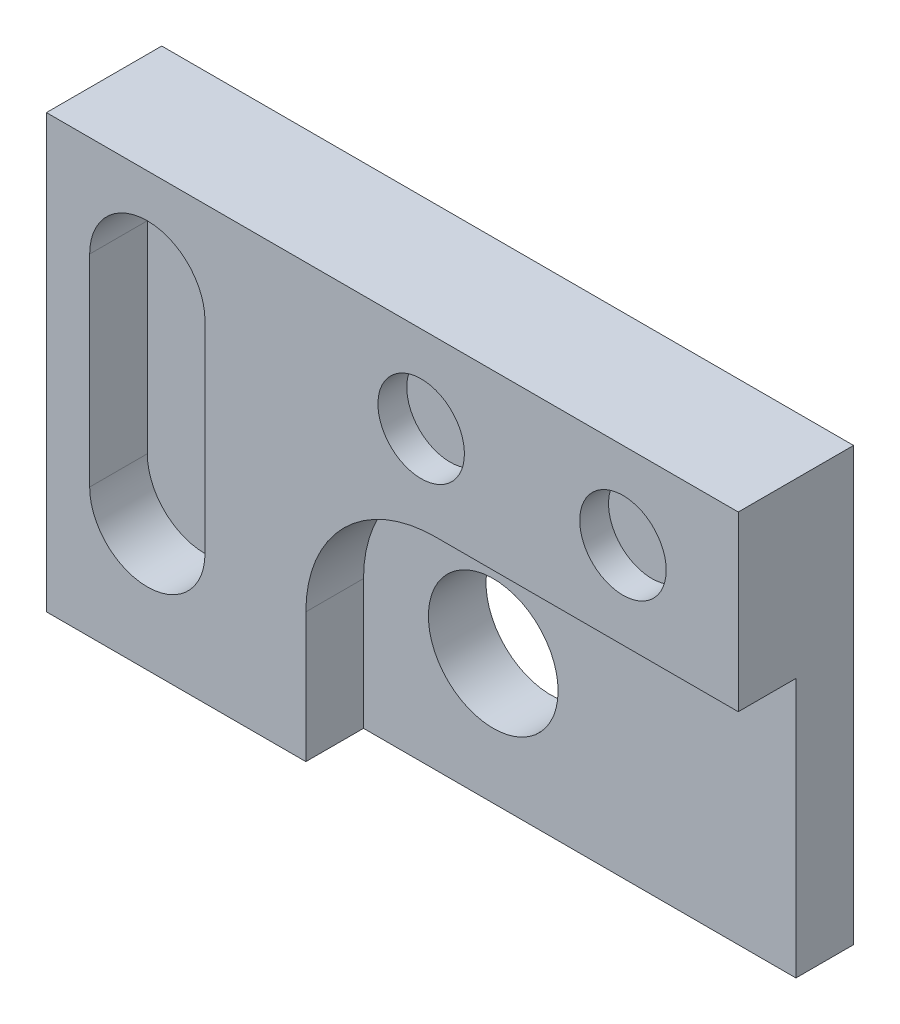
ISO-10303-21;
HEADER;
FILE_DESCRIPTION(('STEP AP214'),'2;1');
FILE_NAME('part.step','',(''),(''),'','','');
FILE_SCHEMA(('AUTOMOTIVE_DESIGN { 1 0 10303 214 1 1 1 1 }'));
ENDSEC;
DATA;
#1=APPLICATION_CONTEXT('core data for automotive mechanical design processes');
#2=APPLICATION_PROTOCOL_DEFINITION('international standard','automotive_design',2000,#1);
#3=PRODUCT_CONTEXT('',#1,'mechanical');
#4=PRODUCT('Part','Part','',(#3));
#5=PRODUCT_RELATED_PRODUCT_CATEGORY('part','',(#4));
#6=PRODUCT_DEFINITION_FORMATION('','',#4);
#7=PRODUCT_DEFINITION_CONTEXT('part definition',#1,'design');
#8=PRODUCT_DEFINITION('design','',#6,#7);
#9=PRODUCT_DEFINITION_SHAPE('','',#8);
#10=(LENGTH_UNIT() NAMED_UNIT(*) SI_UNIT(.MILLI.,.METRE.));
#11=(NAMED_UNIT(*) PLANE_ANGLE_UNIT() SI_UNIT($,.RADIAN.));
#12=(NAMED_UNIT(*) SI_UNIT($,.STERADIAN.) SOLID_ANGLE_UNIT());
#13=UNCERTAINTY_MEASURE_WITH_UNIT(LENGTH_MEASURE(1.E-05),#10,'distance_accuracy_value','');
#14=(GEOMETRIC_REPRESENTATION_CONTEXT(3) GLOBAL_UNCERTAINTY_ASSIGNED_CONTEXT((#13)) GLOBAL_UNIT_ASSIGNED_CONTEXT((#10,
#11,#12)) REPRESENTATION_CONTEXT('',''));
#15=CARTESIAN_POINT('',(0.,0.,0.));
#16=DIRECTION('',(0.,0.,1.));
#17=DIRECTION('',(1.,0.,0.));
#18=AXIS2_PLACEMENT_3D('',#15,#16,#17);
#19=CARTESIAN_POINT('',(15.,-30.,0.));
#20=DIRECTION('',(0.,0.,1.));
#21=DIRECTION('',(1.,0.,0.));
#22=AXIS2_PLACEMENT_3D('',#19,#20,#21);
#23=CYLINDRICAL_SURFACE('',#22,22.5);
#24=CARTESIAN_POINT('',(15.,-30.,0.));
#25=DIRECTION('',(0.,0.,1.));
#26=DIRECTION('',(1.,0.,0.));
#27=AXIS2_PLACEMENT_3D('',#24,#25,#26);
#28=CIRCLE('',#27,22.5);
#29=CARTESIAN_POINT('',(37.5,-30.,0.));
#30=VERTEX_POINT('',#29);
#31=EDGE_CURVE('E203',#30,#30,#28,.T.);
#32=ORIENTED_EDGE('',*,*,#31,.F.);
#33=EDGE_LOOP('',(#32));
#34=FACE_BOUND('',#33,.T.);
#35=CARTESIAN_POINT('',(15.,-30.,20.));
#36=DIRECTION('',(0.,0.,1.));
#37=DIRECTION('',(1.,0.,0.));
#38=AXIS2_PLACEMENT_3D('',#35,#36,#37);
#39=CIRCLE('',#38,22.5);
#40=CARTESIAN_POINT('',(37.5,-30.,20.));
#41=VERTEX_POINT('',#40);
#42=EDGE_CURVE('E165',#41,#41,#39,.T.);
#43=ORIENTED_EDGE('',*,*,#42,.T.);
#44=EDGE_LOOP('',(#43));
#45=FACE_BOUND('',#44,.T.);
#46=ADVANCED_FACE('F52',(#34,#45),#23,.F.);
#47=CARTESIAN_POINT('',(120.,-75.,40.));
#48=DIRECTION('',(-1.,0.,0.));
#49=DIRECTION('',(0.,-1.,0.));
#50=AXIS2_PLACEMENT_3D('',#47,#48,#49);
#51=PLANE('',#50);
#52=DIRECTION('',(0.,1.,0.));
#53=VECTOR('',#52,1.);
#54=CARTESIAN_POINT('',(120.,-75.,40.));
#55=LINE('',#54,#53);
#56=CARTESIAN_POINT('',(120.,15.,40.));
#57=VERTEX_POINT('',#56);
#58=CARTESIAN_POINT('',(120.,75.,40.));
#59=VERTEX_POINT('',#58);
#60=EDGE_CURVE('E298',#57,#59,#55,.T.);
#61=ORIENTED_EDGE('',*,*,#60,.F.);
#62=DIRECTION('',(0.,0.,1.));
#63=VECTOR('',#62,1.);
#64=CARTESIAN_POINT('',(120.,15.,20.));
#65=LINE('',#64,#63);
#66=CARTESIAN_POINT('',(120.,15.,20.));
#67=VERTEX_POINT('',#66);
#68=EDGE_CURVE('E199',#67,#57,#65,.T.);
#69=ORIENTED_EDGE('',*,*,#68,.F.);
#70=DIRECTION('',(0.,1.,0.));
#71=VECTOR('',#70,1.);
#72=CARTESIAN_POINT('',(120.,0.,20.));
#73=LINE('',#72,#71);
#74=CARTESIAN_POINT('',(120.,-75.,20.));
#75=VERTEX_POINT('',#74);
#76=EDGE_CURVE('E150',#75,#67,#73,.T.);
#77=ORIENTED_EDGE('',*,*,#76,.F.);
#78=DIRECTION('',(0.,0.,-1.));
#79=VECTOR('',#78,1.);
#80=CARTESIAN_POINT('',(120.,-75.,40.));
#81=LINE('',#80,#79);
#82=CARTESIAN_POINT('',(120.,-75.,0.));
#83=VERTEX_POINT('',#82);
#84=EDGE_CURVE('E312',#75,#83,#81,.T.);
#85=ORIENTED_EDGE('',*,*,#84,.T.);
#86=DIRECTION('',(0.,1.,0.));
#87=VECTOR('',#86,1.);
#88=CARTESIAN_POINT('',(120.,-75.,0.));
#89=LINE('',#88,#87);
#90=CARTESIAN_POINT('',(120.,75.,0.));
#91=VERTEX_POINT('',#90);
#92=EDGE_CURVE('E286',#83,#91,#89,.T.);
#93=ORIENTED_EDGE('',*,*,#92,.T.);
#94=DIRECTION('',(0.,0.,-1.));
#95=VECTOR('',#94,1.);
#96=CARTESIAN_POINT('',(120.,75.,40.));
#97=LINE('',#96,#95);
#98=EDGE_CURVE('E12',#59,#91,#97,.T.);
#99=ORIENTED_EDGE('',*,*,#98,.F.);
#100=EDGE_LOOP('',(#61,#69,#77,#85,#93,#99));
#101=FACE_BOUND('',#100,.T.);
#102=ADVANCED_FACE('F54',(#101),#51,.F.);
#103=CARTESIAN_POINT('',(-120.,75.,40.));
#104=DIRECTION('',(0.,-1.,0.));
#105=DIRECTION('',(1.,0.,0.));
#106=AXIS2_PLACEMENT_3D('',#103,#104,#105);
#107=PLANE('',#106);
#108=DIRECTION('',(-1.,0.,0.));
#109=VECTOR('',#108,1.);
#110=CARTESIAN_POINT('',(-120.,75.,0.));
#111=LINE('',#110,#109);
#112=CARTESIAN_POINT('',(-120.,75.,0.));
#113=VERTEX_POINT('',#112);
#114=EDGE_CURVE('E316',#91,#113,#111,.T.);
#115=ORIENTED_EDGE('',*,*,#114,.T.);
#116=DIRECTION('',(0.,0.,-1.));
#117=VECTOR('',#116,1.);
#118=CARTESIAN_POINT('',(-120.,75.,40.));
#119=LINE('',#118,#117);
#120=CARTESIAN_POINT('',(-120.,75.,40.));
#121=VERTEX_POINT('',#120);
#122=EDGE_CURVE('E61',#121,#113,#119,.T.);
#123=ORIENTED_EDGE('',*,*,#122,.F.);
#124=DIRECTION('',(-1.,0.,0.));
#125=VECTOR('',#124,1.);
#126=CARTESIAN_POINT('',(-120.,75.,40.));
#127=LINE('',#126,#125);
#128=EDGE_CURVE('E301',#59,#121,#127,.T.);
#129=ORIENTED_EDGE('',*,*,#128,.F.);
#130=ORIENTED_EDGE('',*,*,#98,.T.);
#131=EDGE_LOOP('',(#115,#123,#129,#130));
#132=FACE_BOUND('',#131,.T.);
#133=ADVANCED_FACE('F356',(#132),#107,.F.);
#134=CARTESIAN_POINT('',(-120.,-75.,40.));
#135=DIRECTION('',(1.,0.,0.));
#136=DIRECTION('',(0.,0.,-1.));
#137=AXIS2_PLACEMENT_3D('',#134,#135,#136);
#138=PLANE('',#137);
#139=DIRECTION('',(0.,-1.,0.));
#140=VECTOR('',#139,1.);
#141=CARTESIAN_POINT('',(-120.,-75.,0.));
#142=LINE('',#141,#140);
#143=CARTESIAN_POINT('',(-120.,-75.,0.));
#144=VERTEX_POINT('',#143);
#145=EDGE_CURVE('E319',#113,#144,#142,.T.);
#146=ORIENTED_EDGE('',*,*,#145,.T.);
#147=DIRECTION('',(0.,0.,-1.));
#148=VECTOR('',#147,1.);
#149=CARTESIAN_POINT('',(-120.,-75.,40.));
#150=LINE('',#149,#148);
#151=CARTESIAN_POINT('',(-120.,-75.,40.));
#152=VERTEX_POINT('',#151);
#153=EDGE_CURVE('E327',#152,#144,#150,.T.);
#154=ORIENTED_EDGE('',*,*,#153,.F.);
#155=DIRECTION('',(0.,-1.,0.));
#156=VECTOR('',#155,1.);
#157=CARTESIAN_POINT('',(-120.,-75.,40.));
#158=LINE('',#157,#156);
#159=EDGE_CURVE('E305',#121,#152,#158,.T.);
#160=ORIENTED_EDGE('',*,*,#159,.F.);
#161=ORIENTED_EDGE('',*,*,#122,.T.);
#162=EDGE_LOOP('',(#146,#154,#160,#161));
#163=FACE_BOUND('',#162,.T.);
#164=ADVANCED_FACE('F337',(#163),#138,.F.);
#165=CARTESIAN_POINT('',(-120.,-75.,40.));
#166=DIRECTION('',(0.,1.,0.));
#167=DIRECTION('',(0.,0.,1.));
#168=AXIS2_PLACEMENT_3D('',#165,#166,#167);
#169=PLANE('',#168);
#170=DIRECTION('',(1.,0.,0.));
#171=VECTOR('',#170,1.);
#172=CARTESIAN_POINT('',(0.,-75.,20.));
#173=LINE('',#172,#171);
#174=CARTESIAN_POINT('',(-30.,-75.,20.));
#175=VERTEX_POINT('',#174);
#176=EDGE_CURVE('E188',#175,#75,#173,.T.);
#177=ORIENTED_EDGE('',*,*,#176,.F.);
#178=DIRECTION('',(0.,0.,1.));
#179=VECTOR('',#178,1.);
#180=CARTESIAN_POINT('',(-30.,-75.,20.));
#181=LINE('',#180,#179);
#182=CARTESIAN_POINT('',(-30.,-75.,40.));
#183=VERTEX_POINT('',#182);
#184=EDGE_CURVE('E204',#175,#183,#181,.T.);
#185=ORIENTED_EDGE('',*,*,#184,.T.);
#186=DIRECTION('',(1.,0.,0.));
#187=VECTOR('',#186,1.);
#188=CARTESIAN_POINT('',(-120.,-75.,40.));
#189=LINE('',#188,#187);
#190=EDGE_CURVE('E308',#152,#183,#189,.T.);
#191=ORIENTED_EDGE('',*,*,#190,.F.);
#192=ORIENTED_EDGE('',*,*,#153,.T.);
#193=DIRECTION('',(1.,0.,0.));
#194=VECTOR('',#193,1.);
#195=CARTESIAN_POINT('',(-120.,-75.,0.));
#196=LINE('',#195,#194);
#197=EDGE_CURVE('E302',#144,#83,#196,.T.);
#198=ORIENTED_EDGE('',*,*,#197,.T.);
#199=ORIENTED_EDGE('',*,*,#84,.F.);
#200=EDGE_LOOP('',(#177,#185,#191,#192,#198,#199));
#201=FACE_BOUND('',#200,.T.);
#202=ADVANCED_FACE('F348',(#201),#169,.F.);
#203=CARTESIAN_POINT('',(0.,0.,40.));
#204=DIRECTION('',(0.,0.,-1.));
#205=DIRECTION('',(-1.,0.,0.));
#206=AXIS2_PLACEMENT_3D('',#203,#204,#205);
#207=PLANE('',#206);
#208=CARTESIAN_POINT('',(10.,45.,40.));
#209=DIRECTION('',(0.,0.,1.));
#210=DIRECTION('',(1.,0.,0.));
#211=AXIS2_PLACEMENT_3D('',#208,#209,#210);
#212=CIRCLE('',#211,15.);
#213=CARTESIAN_POINT('',(25.,45.,40.));
#214=VERTEX_POINT('',#213);
#215=EDGE_CURVE('E225',#214,#214,#212,.T.);
#216=ORIENTED_EDGE('',*,*,#215,.F.);
#217=EDGE_LOOP('',(#216));
#218=FACE_BOUND('',#217,.T.);
#219=CARTESIAN_POINT('',(80.,45.,40.));
#220=DIRECTION('',(0.,0.,1.));
#221=DIRECTION('',(1.,0.,0.));
#222=AXIS2_PLACEMENT_3D('',#219,#220,#221);
#223=CIRCLE('',#222,15.);
#224=CARTESIAN_POINT('',(95.,45.,40.));
#225=VERTEX_POINT('',#224);
#226=EDGE_CURVE('E219',#225,#225,#223,.T.);
#227=ORIENTED_EDGE('',*,*,#226,.F.);
#228=EDGE_LOOP('',(#227));
#229=FACE_BOUND('',#228,.T.);
#230=CARTESIAN_POINT('',(-85.,40.,40.));
#231=DIRECTION('',(0.,0.,1.));
#232=DIRECTION('',(1.,0.,0.));
#233=AXIS2_PLACEMENT_3D('',#230,#231,#232);
#234=CIRCLE('',#233,20.);
#235=CARTESIAN_POINT('',(-65.,40.,40.));
#236=VERTEX_POINT('',#235);
#237=CARTESIAN_POINT('',(-105.,40.,40.));
#238=VERTEX_POINT('',#237);
#239=EDGE_CURVE('E271',#236,#238,#234,.T.);
#240=ORIENTED_EDGE('',*,*,#239,.F.);
#241=DIRECTION('',(0.,1.,0.));
#242=VECTOR('',#241,1.);
#243=CARTESIAN_POINT('',(-65.,0.,40.));
#244=LINE('',#243,#242);
#245=CARTESIAN_POINT('',(-65.,-30.,40.));
#246=VERTEX_POINT('',#245);
#247=EDGE_CURVE('E76',#246,#236,#244,.T.);
#248=ORIENTED_EDGE('',*,*,#247,.F.);
#249=CARTESIAN_POINT('',(-85.,-30.,40.));
#250=DIRECTION('',(0.,0.,1.));
#251=DIRECTION('',(1.,0.,0.));
#252=AXIS2_PLACEMENT_3D('',#249,#250,#251);
#253=CIRCLE('',#252,20.);
#254=CARTESIAN_POINT('',(-105.,-30.,40.));
#255=VERTEX_POINT('',#254);
#256=EDGE_CURVE('E247',#255,#246,#253,.T.);
#257=ORIENTED_EDGE('',*,*,#256,.F.);
#258=DIRECTION('',(0.,1.,0.));
#259=VECTOR('',#258,1.);
#260=CARTESIAN_POINT('',(-105.,0.,40.));
#261=LINE('',#260,#259);
#262=EDGE_CURVE('E275',#255,#238,#261,.T.);
#263=ORIENTED_EDGE('',*,*,#262,.T.);
#264=EDGE_LOOP('',(#240,#248,#257,#263));
#265=FACE_BOUND('',#264,.T.);
#266=CARTESIAN_POINT('',(15.,-30.,40.));
#267=DIRECTION('',(0.,0.,1.));
#268=DIRECTION('',(1.,0.,0.));
#269=AXIS2_PLACEMENT_3D('',#266,#267,#268);
#270=CIRCLE('',#269,45.);
#271=CARTESIAN_POINT('',(15.,15.,40.));
#272=VERTEX_POINT('',#271);
#273=CARTESIAN_POINT('',(-30.,-30.,40.));
#274=VERTEX_POINT('',#273);
#275=EDGE_CURVE('E192',#272,#274,#270,.T.);
#276=ORIENTED_EDGE('',*,*,#275,.F.);
#277=DIRECTION('',(-1.,0.,0.));
#278=VECTOR('',#277,1.);
#279=CARTESIAN_POINT('',(0.,15.,40.));
#280=LINE('',#279,#278);
#281=EDGE_CURVE('E68',#57,#272,#280,.T.);
#282=ORIENTED_EDGE('',*,*,#281,.F.);
#283=ORIENTED_EDGE('',*,*,#60,.T.);
#284=ORIENTED_EDGE('',*,*,#128,.T.);
#285=ORIENTED_EDGE('',*,*,#159,.T.);
#286=ORIENTED_EDGE('',*,*,#190,.T.);
#287=DIRECTION('',(0.,-1.,0.));
#288=VECTOR('',#287,1.);
#289=CARTESIAN_POINT('',(-30.,0.,40.));
#290=LINE('',#289,#288);
#291=EDGE_CURVE('E171',#274,#183,#290,.T.);
#292=ORIENTED_EDGE('',*,*,#291,.F.);
#293=EDGE_LOOP('',(#276,#282,#283,#284,#285,#286,#292));
#294=FACE_BOUND('',#293,.T.);
#295=ADVANCED_FACE('F353',(#218,#229,#265,#294),#207,.F.);
#296=CARTESIAN_POINT('',(0.,0.,0.));
#297=DIRECTION('',(0.,0.,-1.));
#298=DIRECTION('',(-1.,0.,0.));
#299=AXIS2_PLACEMENT_3D('',#296,#297,#298);
#300=PLANE('',#299);
#301=ORIENTED_EDGE('',*,*,#31,.T.);
#302=EDGE_LOOP('',(#301));
#303=FACE_BOUND('',#302,.T.);
#304=ORIENTED_EDGE('',*,*,#92,.F.);
#305=ORIENTED_EDGE('',*,*,#197,.F.);
#306=ORIENTED_EDGE('',*,*,#145,.F.);
#307=ORIENTED_EDGE('',*,*,#114,.F.);
#308=EDGE_LOOP('',(#304,#305,#306,#307));
#309=FACE_BOUND('',#308,.T.);
#310=ADVANCED_FACE('F344',(#303,#309),#300,.T.);
#311=CARTESIAN_POINT('',(-65.,0.,20.));
#312=DIRECTION('',(1.,0.,0.));
#313=DIRECTION('',(0.,1.,0.));
#314=AXIS2_PLACEMENT_3D('',#311,#312,#313);
#315=PLANE('',#314);
#316=ORIENTED_EDGE('',*,*,#247,.T.);
#317=DIRECTION('',(0.,0.,1.));
#318=VECTOR('',#317,1.);
#319=CARTESIAN_POINT('',(-65.,40.,20.));
#320=LINE('',#319,#318);
#321=CARTESIAN_POINT('',(-65.,40.,20.));
#322=VERTEX_POINT('',#321);
#323=EDGE_CURVE('E267',#322,#236,#320,.T.);
#324=ORIENTED_EDGE('',*,*,#323,.F.);
#325=DIRECTION('',(0.,1.,0.));
#326=VECTOR('',#325,1.);
#327=CARTESIAN_POINT('',(-65.,0.,20.));
#328=LINE('',#327,#326);
#329=CARTESIAN_POINT('',(-65.,-30.,20.));
#330=VERTEX_POINT('',#329);
#331=EDGE_CURVE('E241',#330,#322,#328,.T.);
#332=ORIENTED_EDGE('',*,*,#331,.F.);
#333=DIRECTION('',(0.,0.,1.));
#334=VECTOR('',#333,1.);
#335=CARTESIAN_POINT('',(-65.,-30.,20.));
#336=LINE('',#335,#334);
#337=EDGE_CURVE('E283',#330,#246,#336,.T.);
#338=ORIENTED_EDGE('',*,*,#337,.T.);
#339=EDGE_LOOP('',(#316,#324,#332,#338));
#340=FACE_BOUND('',#339,.T.);
#341=ADVANCED_FACE('F404',(#340),#315,.F.);
#342=CARTESIAN_POINT('',(-85.,-30.,20.));
#343=DIRECTION('',(0.,0.,1.));
#344=DIRECTION('',(1.,0.,0.));
#345=AXIS2_PLACEMENT_3D('',#342,#343,#344);
#346=CYLINDRICAL_SURFACE('',#345,20.);
#347=ORIENTED_EDGE('',*,*,#256,.T.);
#348=ORIENTED_EDGE('',*,*,#337,.F.);
#349=CARTESIAN_POINT('',(-85.,-30.,20.));
#350=DIRECTION('',(0.,0.,1.));
#351=DIRECTION('',(1.,0.,0.));
#352=AXIS2_PLACEMENT_3D('',#349,#350,#351);
#353=CIRCLE('',#352,20.);
#354=CARTESIAN_POINT('',(-105.,-30.,20.));
#355=VERTEX_POINT('',#354);
#356=EDGE_CURVE('E262',#355,#330,#353,.T.);
#357=ORIENTED_EDGE('',*,*,#356,.F.);
#358=DIRECTION('',(0.,0.,1.));
#359=VECTOR('',#358,1.);
#360=CARTESIAN_POINT('',(-105.,-30.,20.));
#361=LINE('',#360,#359);
#362=EDGE_CURVE('E287',#355,#255,#361,.T.);
#363=ORIENTED_EDGE('',*,*,#362,.T.);
#364=EDGE_LOOP('',(#347,#348,#357,#363));
#365=FACE_BOUND('',#364,.T.);
#366=ADVANCED_FACE('F400',(#365),#346,.F.);
#367=CARTESIAN_POINT('',(-105.,0.,20.));
#368=DIRECTION('',(1.,0.,0.));
#369=DIRECTION('',(0.,1.,0.));
#370=AXIS2_PLACEMENT_3D('',#367,#368,#369);
#371=PLANE('',#370);
#372=ORIENTED_EDGE('',*,*,#262,.F.);
#373=ORIENTED_EDGE('',*,*,#362,.F.);
#374=DIRECTION('',(0.,1.,0.));
#375=VECTOR('',#374,1.);
#376=CARTESIAN_POINT('',(-105.,0.,20.));
#377=LINE('',#376,#375);
#378=CARTESIAN_POINT('',(-105.,40.,20.));
#379=VERTEX_POINT('',#378);
#380=EDGE_CURVE('E259',#355,#379,#377,.T.);
#381=ORIENTED_EDGE('',*,*,#380,.T.);
#382=DIRECTION('',(0.,0.,1.));
#383=VECTOR('',#382,1.);
#384=CARTESIAN_POINT('',(-105.,40.,20.));
#385=LINE('',#384,#383);
#386=EDGE_CURVE('E292',#379,#238,#385,.T.);
#387=ORIENTED_EDGE('',*,*,#386,.T.);
#388=EDGE_LOOP('',(#372,#373,#381,#387));
#389=FACE_BOUND('',#388,.T.);
#390=ADVANCED_FACE('F403',(#389),#371,.T.);
#391=CARTESIAN_POINT('',(-85.,40.,20.));
#392=DIRECTION('',(0.,0.,1.));
#393=DIRECTION('',(1.,0.,0.));
#394=AXIS2_PLACEMENT_3D('',#391,#392,#393);
#395=CYLINDRICAL_SURFACE('',#394,20.);
#396=ORIENTED_EDGE('',*,*,#239,.T.);
#397=ORIENTED_EDGE('',*,*,#386,.F.);
#398=CARTESIAN_POINT('',(-85.,40.,20.));
#399=DIRECTION('',(0.,0.,1.));
#400=DIRECTION('',(1.,0.,0.));
#401=AXIS2_PLACEMENT_3D('',#398,#399,#400);
#402=CIRCLE('',#401,20.);
#403=EDGE_CURVE('E246',#322,#379,#402,.T.);
#404=ORIENTED_EDGE('',*,*,#403,.F.);
#405=ORIENTED_EDGE('',*,*,#323,.T.);
#406=EDGE_LOOP('',(#396,#397,#404,#405));
#407=FACE_BOUND('',#406,.T.);
#408=ADVANCED_FACE('F398',(#407),#395,.F.);
#409=CARTESIAN_POINT('',(0.,0.,20.));
#410=DIRECTION('',(0.,0.,1.));
#411=DIRECTION('',(1.,0.,0.));
#412=AXIS2_PLACEMENT_3D('',#409,#410,#411);
#413=PLANE('',#412);
#414=ORIENTED_EDGE('',*,*,#331,.T.);
#415=ORIENTED_EDGE('',*,*,#403,.T.);
#416=ORIENTED_EDGE('',*,*,#380,.F.);
#417=ORIENTED_EDGE('',*,*,#356,.T.);
#418=EDGE_LOOP('',(#414,#415,#416,#417));
#419=FACE_BOUND('',#418,.T.);
#420=ADVANCED_FACE('F394',(#419),#413,.T.);
#421=CARTESIAN_POINT('',(80.,45.,30.));
#422=DIRECTION('',(0.,0.,1.));
#423=DIRECTION('',(1.,0.,0.));
#424=AXIS2_PLACEMENT_3D('',#421,#422,#423);
#425=CYLINDRICAL_SURFACE('',#424,15.);
#426=CARTESIAN_POINT('',(80.,45.,30.));
#427=DIRECTION('',(0.,0.,1.));
#428=DIRECTION('',(1.,0.,0.));
#429=AXIS2_PLACEMENT_3D('',#426,#427,#428);
#430=CIRCLE('',#429,15.);
#431=CARTESIAN_POINT('',(95.,45.,30.));
#432=VERTEX_POINT('',#431);
#433=EDGE_CURVE('E233',#432,#432,#430,.T.);
#434=ORIENTED_EDGE('',*,*,#433,.F.);
#435=EDGE_LOOP('',(#434));
#436=FACE_BOUND('',#435,.T.);
#437=ORIENTED_EDGE('',*,*,#226,.T.);
#438=EDGE_LOOP('',(#437));
#439=FACE_BOUND('',#438,.T.);
#440=ADVANCED_FACE('F390',(#436,#439),#425,.F.);
#441=CARTESIAN_POINT('',(0.,0.,30.));
#442=DIRECTION('',(0.,0.,1.));
#443=DIRECTION('',(1.,0.,0.));
#444=AXIS2_PLACEMENT_3D('',#441,#442,#443);
#445=PLANE('',#444);
#446=ORIENTED_EDGE('',*,*,#433,.T.);
#447=EDGE_LOOP('',(#446));
#448=FACE_BOUND('',#447,.T.);
#449=ADVANCED_FACE('F387',(#448),#445,.T.);
#450=CARTESIAN_POINT('',(10.,45.,30.));
#451=DIRECTION('',(0.,0.,1.));
#452=DIRECTION('',(1.,0.,0.));
#453=AXIS2_PLACEMENT_3D('',#450,#451,#452);
#454=CYLINDRICAL_SURFACE('',#453,15.);
#455=CARTESIAN_POINT('',(10.,45.,30.));
#456=DIRECTION('',(0.,0.,1.));
#457=DIRECTION('',(1.,0.,0.));
#458=AXIS2_PLACEMENT_3D('',#455,#456,#457);
#459=CIRCLE('',#458,15.);
#460=CARTESIAN_POINT('',(25.,45.,30.));
#461=VERTEX_POINT('',#460);
#462=EDGE_CURVE('E220',#461,#461,#459,.T.);
#463=ORIENTED_EDGE('',*,*,#462,.F.);
#464=EDGE_LOOP('',(#463));
#465=FACE_BOUND('',#464,.T.);
#466=ORIENTED_EDGE('',*,*,#215,.T.);
#467=EDGE_LOOP('',(#466));
#468=FACE_BOUND('',#467,.T.);
#469=ADVANCED_FACE('F383',(#465,#468),#454,.F.);
#470=CARTESIAN_POINT('',(0.,0.,30.));
#471=DIRECTION('',(0.,0.,1.));
#472=DIRECTION('',(1.,0.,0.));
#473=AXIS2_PLACEMENT_3D('',#470,#471,#472);
#474=PLANE('',#473);
#475=ORIENTED_EDGE('',*,*,#462,.T.);
#476=EDGE_LOOP('',(#475));
#477=FACE_BOUND('',#476,.T.);
#478=ADVANCED_FACE('F380',(#477),#474,.T.);
#479=CARTESIAN_POINT('',(0.,15.,20.));
#480=DIRECTION('',(0.,1.,0.));
#481=DIRECTION('',(-1.,0.,0.));
#482=AXIS2_PLACEMENT_3D('',#479,#480,#481);
#483=PLANE('',#482);
#484=ORIENTED_EDGE('',*,*,#281,.T.);
#485=DIRECTION('',(0.,0.,1.));
#486=VECTOR('',#485,1.);
#487=CARTESIAN_POINT('',(15.,15.,20.));
#488=LINE('',#487,#486);
#489=CARTESIAN_POINT('',(15.,15.,20.));
#490=VERTEX_POINT('',#489);
#491=EDGE_CURVE('E139',#490,#272,#488,.T.);
#492=ORIENTED_EDGE('',*,*,#491,.F.);
#493=DIRECTION('',(-1.,0.,0.));
#494=VECTOR('',#493,1.);
#495=CARTESIAN_POINT('',(0.,15.,20.));
#496=LINE('',#495,#494);
#497=EDGE_CURVE('E143',#67,#490,#496,.T.);
#498=ORIENTED_EDGE('',*,*,#497,.F.);
#499=ORIENTED_EDGE('',*,*,#68,.T.);
#500=EDGE_LOOP('',(#484,#492,#498,#499));
#501=FACE_BOUND('',#500,.T.);
#502=ADVANCED_FACE('F141',(#501),#483,.F.);
#503=CARTESIAN_POINT('',(-30.,0.,20.));
#504=DIRECTION('',(-1.,0.,0.));
#505=DIRECTION('',(0.,-1.,0.));
#506=AXIS2_PLACEMENT_3D('',#503,#504,#505);
#507=PLANE('',#506);
#508=ORIENTED_EDGE('',*,*,#291,.T.);
#509=ORIENTED_EDGE('',*,*,#184,.F.);
#510=DIRECTION('',(0.,-1.,0.));
#511=VECTOR('',#510,1.);
#512=CARTESIAN_POINT('',(-30.,0.,20.));
#513=LINE('',#512,#511);
#514=CARTESIAN_POINT('',(-30.,-30.,20.));
#515=VERTEX_POINT('',#514);
#516=EDGE_CURVE('E159',#515,#175,#513,.T.);
#517=ORIENTED_EDGE('',*,*,#516,.F.);
#518=DIRECTION('',(0.,0.,1.));
#519=VECTOR('',#518,1.);
#520=CARTESIAN_POINT('',(-30.,-30.,20.));
#521=LINE('',#520,#519);
#522=EDGE_CURVE('E149',#515,#274,#521,.T.);
#523=ORIENTED_EDGE('',*,*,#522,.T.);
#524=EDGE_LOOP('',(#508,#509,#517,#523));
#525=FACE_BOUND('',#524,.T.);
#526=ADVANCED_FACE('F529',(#525),#507,.F.);
#527=CARTESIAN_POINT('',(15.,-30.,20.));
#528=DIRECTION('',(0.,0.,1.));
#529=DIRECTION('',(1.,0.,0.));
#530=AXIS2_PLACEMENT_3D('',#527,#528,#529);
#531=CYLINDRICAL_SURFACE('',#530,45.);
#532=ORIENTED_EDGE('',*,*,#275,.T.);
#533=ORIENTED_EDGE('',*,*,#522,.F.);
#534=CARTESIAN_POINT('',(15.,-30.,20.));
#535=DIRECTION('',(0.,0.,1.));
#536=DIRECTION('',(1.,0.,0.));
#537=AXIS2_PLACEMENT_3D('',#534,#535,#536);
#538=CIRCLE('',#537,45.);
#539=EDGE_CURVE('E153',#490,#515,#538,.T.);
#540=ORIENTED_EDGE('',*,*,#539,.F.);
#541=ORIENTED_EDGE('',*,*,#491,.T.);
#542=EDGE_LOOP('',(#532,#533,#540,#541));
#543=FACE_BOUND('',#542,.T.);
#544=ADVANCED_FACE('F154',(#543),#531,.F.);
#545=CARTESIAN_POINT('',(0.,0.,20.));
#546=DIRECTION('',(0.,0.,1.));
#547=DIRECTION('',(1.,0.,0.));
#548=AXIS2_PLACEMENT_3D('',#545,#546,#547);
#549=PLANE('',#548);
#550=ORIENTED_EDGE('',*,*,#42,.F.);
#551=EDGE_LOOP('',(#550));
#552=FACE_BOUND('',#551,.T.);
#553=ORIENTED_EDGE('',*,*,#497,.T.);
#554=ORIENTED_EDGE('',*,*,#539,.T.);
#555=ORIENTED_EDGE('',*,*,#516,.T.);
#556=ORIENTED_EDGE('',*,*,#176,.T.);
#557=ORIENTED_EDGE('',*,*,#76,.T.);
#558=EDGE_LOOP('',(#553,#554,#555,#556,#557));
#559=FACE_BOUND('',#558,.T.);
#560=ADVANCED_FACE('F161',(#552,#559),#549,.T.);
#561=CLOSED_SHELL('',(#46,#102,#133,#164,#202,#295,#310,#341,#366,#390,#408,#420,#440,#449,#469,
#478,#502,#526,#544,#560));
#562=MANIFOLD_SOLID_BREP('B2',#561);
#563=ADVANCED_BREP_SHAPE_REPRESENTATION('',(#18,#562),#14);
#564=SHAPE_DEFINITION_REPRESENTATION(#9,#563);
ENDSEC;
END-ISO-10303-21;
